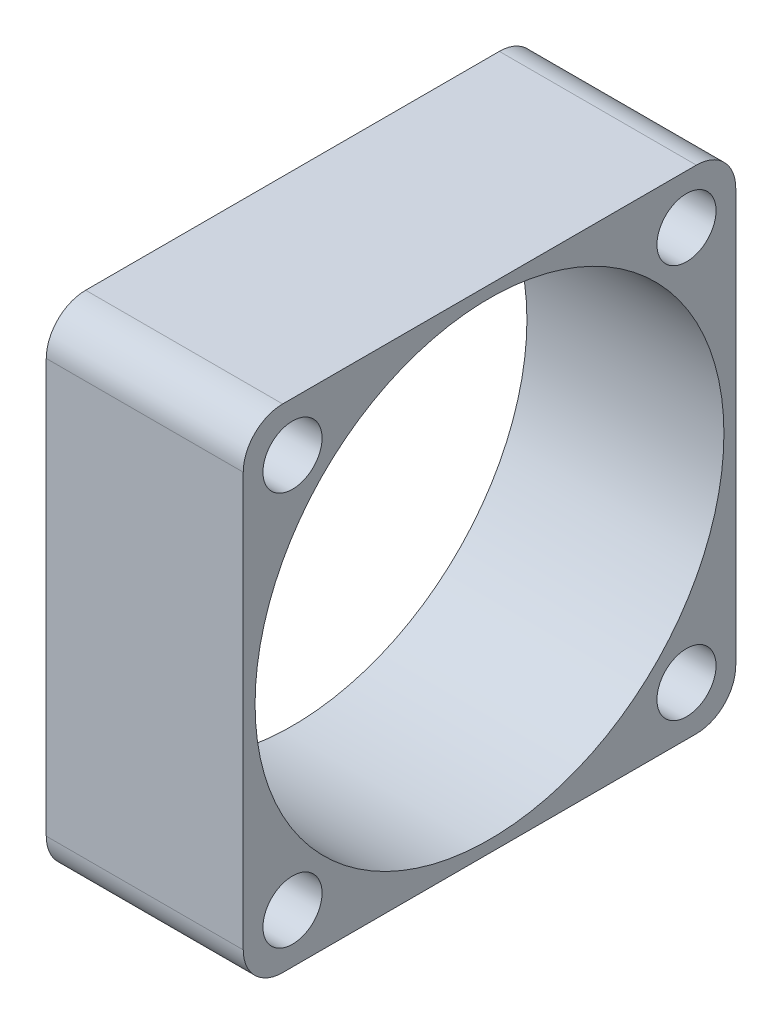
ISO-10303-21;
HEADER;
FILE_DESCRIPTION(('STEP AP214'),'2;1');
FILE_NAME('part.step','',(''),(''),'','','');
FILE_SCHEMA(('AUTOMOTIVE_DESIGN { 1 0 10303 214 1 1 1 1 }'));
ENDSEC;
DATA;
#1=APPLICATION_CONTEXT('core data for automotive mechanical design processes');
#2=APPLICATION_PROTOCOL_DEFINITION('international standard','automotive_design',2000,#1);
#3=PRODUCT_CONTEXT('',#1,'mechanical');
#4=PRODUCT('Part','Part','',(#3));
#5=PRODUCT_RELATED_PRODUCT_CATEGORY('part','',(#4));
#6=PRODUCT_DEFINITION_FORMATION('','',#4);
#7=PRODUCT_DEFINITION_CONTEXT('part definition',#1,'design');
#8=PRODUCT_DEFINITION('design','',#6,#7);
#9=PRODUCT_DEFINITION_SHAPE('','',#8);
#10=(LENGTH_UNIT() NAMED_UNIT(*) SI_UNIT(.MILLI.,.METRE.));
#11=(NAMED_UNIT(*) PLANE_ANGLE_UNIT() SI_UNIT($,.RADIAN.));
#12=(NAMED_UNIT(*) SI_UNIT($,.STERADIAN.) SOLID_ANGLE_UNIT());
#13=UNCERTAINTY_MEASURE_WITH_UNIT(LENGTH_MEASURE(1.E-05),#10,'distance_accuracy_value','');
#14=(GEOMETRIC_REPRESENTATION_CONTEXT(3) GLOBAL_UNCERTAINTY_ASSIGNED_CONTEXT((#13)) GLOBAL_UNIT_ASSIGNED_CONTEXT((#10,
#11,#12)) REPRESENTATION_CONTEXT('',''));
#15=CARTESIAN_POINT('',(0.,0.,0.));
#16=DIRECTION('',(0.,0.,1.));
#17=DIRECTION('',(1.,0.,0.));
#18=AXIS2_PLACEMENT_3D('',#15,#16,#17);
#19=CARTESIAN_POINT('',(10.,-10.5,10.5));
#20=DIRECTION('',(-1.,0.,0.));
#21=DIRECTION('',(0.,0.,1.));
#22=AXIS2_PLACEMENT_3D('',#19,#20,#21);
#23=CYLINDRICAL_SURFACE('',#22,2.);
#24=CARTESIAN_POINT('',(0.,-10.5,10.5));
#25=DIRECTION('',(1.,0.,0.));
#26=DIRECTION('',(0.,0.,1.));
#27=AXIS2_PLACEMENT_3D('',#24,#25,#26);
#28=CIRCLE('',#27,2.);
#29=CARTESIAN_POINT('',(0.,-10.5,12.5));
#30=VERTEX_POINT('',#29);
#31=CARTESIAN_POINT('',(0.,-12.5,10.5));
#32=VERTEX_POINT('',#31);
#33=EDGE_CURVE('E113',#30,#32,#28,.T.);
#34=ORIENTED_EDGE('',*,*,#33,.T.);
#35=DIRECTION('',(-1.,0.,0.));
#36=VECTOR('',#35,1.);
#37=CARTESIAN_POINT('',(10.,-12.5,10.5));
#38=LINE('',#37,#36);
#39=CARTESIAN_POINT('',(10.,-12.5,10.5));
#40=VERTEX_POINT('',#39);
#41=EDGE_CURVE('E11',#40,#32,#38,.T.);
#42=ORIENTED_EDGE('',*,*,#41,.F.);
#43=CARTESIAN_POINT('',(10.,-10.5,10.5));
#44=DIRECTION('',(1.,0.,0.));
#45=DIRECTION('',(0.,0.,1.));
#46=AXIS2_PLACEMENT_3D('',#43,#44,#45);
#47=CIRCLE('',#46,2.);
#48=CARTESIAN_POINT('',(10.,-10.5,12.5));
#49=VERTEX_POINT('',#48);
#50=EDGE_CURVE('E128',#49,#40,#47,.T.);
#51=ORIENTED_EDGE('',*,*,#50,.F.);
#52=DIRECTION('',(-1.,0.,0.));
#53=VECTOR('',#52,1.);
#54=CARTESIAN_POINT('',(10.,-10.5,12.5));
#55=LINE('',#54,#53);
#56=EDGE_CURVE('E109',#49,#30,#55,.T.);
#57=ORIENTED_EDGE('',*,*,#56,.T.);
#58=EDGE_LOOP('',(#34,#42,#51,#57));
#59=FACE_BOUND('',#58,.T.);
#60=ADVANCED_FACE('F17',(#59),#23,.T.);
#61=CARTESIAN_POINT('',(10.,-12.5,-10.5));
#62=DIRECTION('',(0.,1.,0.));
#63=DIRECTION('',(0.,0.,1.));
#64=AXIS2_PLACEMENT_3D('',#61,#62,#63);
#65=PLANE('',#64);
#66=DIRECTION('',(0.,0.,-1.));
#67=VECTOR('',#66,1.);
#68=CARTESIAN_POINT('',(0.,-12.5,-10.5));
#69=LINE('',#68,#67);
#70=CARTESIAN_POINT('',(0.,-12.5,-10.5));
#71=VERTEX_POINT('',#70);
#72=EDGE_CURVE('E116',#32,#71,#69,.T.);
#73=ORIENTED_EDGE('',*,*,#72,.T.);
#74=DIRECTION('',(-1.,0.,0.));
#75=VECTOR('',#74,1.);
#76=CARTESIAN_POINT('',(10.,-12.5,-10.5));
#77=LINE('',#76,#75);
#78=CARTESIAN_POINT('',(10.,-12.5,-10.5));
#79=VERTEX_POINT('',#78);
#80=EDGE_CURVE('E25',#79,#71,#77,.T.);
#81=ORIENTED_EDGE('',*,*,#80,.F.);
#82=DIRECTION('',(0.,0.,-1.));
#83=VECTOR('',#82,1.);
#84=CARTESIAN_POINT('',(10.,-12.5,-10.5));
#85=LINE('',#84,#83);
#86=EDGE_CURVE('E76',#40,#79,#85,.T.);
#87=ORIENTED_EDGE('',*,*,#86,.F.);
#88=ORIENTED_EDGE('',*,*,#41,.T.);
#89=EDGE_LOOP('',(#73,#81,#87,#88));
#90=FACE_BOUND('',#89,.T.);
#91=ADVANCED_FACE('F224',(#90),#65,.F.);
#92=CARTESIAN_POINT('',(10.,-10.5,-10.5));
#93=DIRECTION('',(-1.,0.,0.));
#94=DIRECTION('',(0.,0.,1.));
#95=AXIS2_PLACEMENT_3D('',#92,#93,#94);
#96=CYLINDRICAL_SURFACE('',#95,2.);
#97=CARTESIAN_POINT('',(0.,-10.5,-10.5));
#98=DIRECTION('',(1.,0.,0.));
#99=DIRECTION('',(0.,0.,-1.));
#100=AXIS2_PLACEMENT_3D('',#97,#98,#99);
#101=CIRCLE('',#100,2.);
#102=CARTESIAN_POINT('',(0.,-10.5,-12.5));
#103=VERTEX_POINT('',#102);
#104=EDGE_CURVE('E119',#71,#103,#101,.T.);
#105=ORIENTED_EDGE('',*,*,#104,.T.);
#106=DIRECTION('',(-1.,0.,0.));
#107=VECTOR('',#106,1.);
#108=CARTESIAN_POINT('',(10.,-10.5,-12.5));
#109=LINE('',#108,#107);
#110=CARTESIAN_POINT('',(10.,-10.5,-12.5));
#111=VERTEX_POINT('',#110);
#112=EDGE_CURVE('E135',#111,#103,#109,.T.);
#113=ORIENTED_EDGE('',*,*,#112,.F.);
#114=CARTESIAN_POINT('',(10.,-10.5,-10.5));
#115=DIRECTION('',(1.,0.,0.));
#116=DIRECTION('',(0.,0.,-1.));
#117=AXIS2_PLACEMENT_3D('',#114,#115,#116);
#118=CIRCLE('',#117,2.);
#119=EDGE_CURVE('E143',#79,#111,#118,.T.);
#120=ORIENTED_EDGE('',*,*,#119,.F.);
#121=ORIENTED_EDGE('',*,*,#80,.T.);
#122=EDGE_LOOP('',(#105,#113,#120,#121));
#123=FACE_BOUND('',#122,.T.);
#124=ADVANCED_FACE('F141',(#123),#96,.T.);
#125=CARTESIAN_POINT('',(10.,-10.5,-12.5));
#126=DIRECTION('',(0.,0.,1.));
#127=DIRECTION('',(0.,-1.,0.));
#128=AXIS2_PLACEMENT_3D('',#125,#126,#127);
#129=PLANE('',#128);
#130=DIRECTION('',(0.,1.,0.));
#131=VECTOR('',#130,1.);
#132=CARTESIAN_POINT('',(0.,-10.5,-12.5));
#133=LINE('',#132,#131);
#134=CARTESIAN_POINT('',(0.,10.5,-12.5));
#135=VERTEX_POINT('',#134);
#136=EDGE_CURVE('E121',#103,#135,#133,.T.);
#137=ORIENTED_EDGE('',*,*,#136,.T.);
#138=DIRECTION('',(-1.,0.,0.));
#139=VECTOR('',#138,1.);
#140=CARTESIAN_POINT('',(10.,10.5,-12.5));
#141=LINE('',#140,#139);
#142=CARTESIAN_POINT('',(10.,10.5,-12.5));
#143=VERTEX_POINT('',#142);
#144=EDGE_CURVE('E132',#143,#135,#141,.T.);
#145=ORIENTED_EDGE('',*,*,#144,.F.);
#146=DIRECTION('',(0.,1.,0.));
#147=VECTOR('',#146,1.);
#148=CARTESIAN_POINT('',(10.,-10.5,-12.5));
#149=LINE('',#148,#147);
#150=EDGE_CURVE('E155',#111,#143,#149,.T.);
#151=ORIENTED_EDGE('',*,*,#150,.F.);
#152=ORIENTED_EDGE('',*,*,#112,.T.);
#153=EDGE_LOOP('',(#137,#145,#151,#152));
#154=FACE_BOUND('',#153,.T.);
#155=ADVANCED_FACE('F151',(#154),#129,.F.);
#156=CARTESIAN_POINT('',(10.,10.5,-10.5));
#157=DIRECTION('',(-1.,0.,0.));
#158=DIRECTION('',(0.,0.,1.));
#159=AXIS2_PLACEMENT_3D('',#156,#157,#158);
#160=CYLINDRICAL_SURFACE('',#159,2.);
#161=CARTESIAN_POINT('',(0.,10.5,-10.5));
#162=DIRECTION('',(1.,0.,0.));
#163=DIRECTION('',(0.,0.,-1.));
#164=AXIS2_PLACEMENT_3D('',#161,#162,#163);
#165=CIRCLE('',#164,2.);
#166=CARTESIAN_POINT('',(0.,12.5,-10.5));
#167=VERTEX_POINT('',#166);
#168=EDGE_CURVE('E123',#135,#167,#165,.T.);
#169=ORIENTED_EDGE('',*,*,#168,.T.);
#170=DIRECTION('',(-1.,0.,0.));
#171=VECTOR('',#170,1.);
#172=CARTESIAN_POINT('',(10.,12.5,-10.5));
#173=LINE('',#172,#171);
#174=CARTESIAN_POINT('',(10.,12.5,-10.5));
#175=VERTEX_POINT('',#174);
#176=EDGE_CURVE('E104',#175,#167,#173,.T.);
#177=ORIENTED_EDGE('',*,*,#176,.F.);
#178=CARTESIAN_POINT('',(10.,10.5,-10.5));
#179=DIRECTION('',(1.,0.,0.));
#180=DIRECTION('',(0.,0.,-1.));
#181=AXIS2_PLACEMENT_3D('',#178,#179,#180);
#182=CIRCLE('',#181,2.);
#183=EDGE_CURVE('E95',#143,#175,#182,.T.);
#184=ORIENTED_EDGE('',*,*,#183,.F.);
#185=ORIENTED_EDGE('',*,*,#144,.T.);
#186=EDGE_LOOP('',(#169,#177,#184,#185));
#187=FACE_BOUND('',#186,.T.);
#188=ADVANCED_FACE('F154',(#187),#160,.T.);
#189=CARTESIAN_POINT('',(10.,12.5,-10.5));
#190=DIRECTION('',(0.,-1.,0.));
#191=DIRECTION('',(0.,0.,-1.));
#192=AXIS2_PLACEMENT_3D('',#189,#190,#191);
#193=PLANE('',#192);
#194=DIRECTION('',(0.,0.,1.));
#195=VECTOR('',#194,1.);
#196=CARTESIAN_POINT('',(0.,12.5,-10.5));
#197=LINE('',#196,#195);
#198=CARTESIAN_POINT('',(0.,12.5,10.5));
#199=VERTEX_POINT('',#198);
#200=EDGE_CURVE('E103',#167,#199,#197,.T.);
#201=ORIENTED_EDGE('',*,*,#200,.T.);
#202=DIRECTION('',(-1.,0.,0.));
#203=VECTOR('',#202,1.);
#204=CARTESIAN_POINT('',(10.,12.5,10.5));
#205=LINE('',#204,#203);
#206=CARTESIAN_POINT('',(10.,12.5,10.5));
#207=VERTEX_POINT('',#206);
#208=EDGE_CURVE('E100',#207,#199,#205,.T.);
#209=ORIENTED_EDGE('',*,*,#208,.F.);
#210=DIRECTION('',(0.,0.,1.));
#211=VECTOR('',#210,1.);
#212=CARTESIAN_POINT('',(10.,12.5,-10.5));
#213=LINE('',#212,#211);
#214=EDGE_CURVE('E89',#175,#207,#213,.T.);
#215=ORIENTED_EDGE('',*,*,#214,.F.);
#216=ORIENTED_EDGE('',*,*,#176,.T.);
#217=EDGE_LOOP('',(#201,#209,#215,#216));
#218=FACE_BOUND('',#217,.T.);
#219=ADVANCED_FACE('F101',(#218),#193,.F.);
#220=CARTESIAN_POINT('',(10.,10.5,10.5));
#221=DIRECTION('',(-1.,0.,0.));
#222=DIRECTION('',(0.,0.,1.));
#223=AXIS2_PLACEMENT_3D('',#220,#221,#222);
#224=CYLINDRICAL_SURFACE('',#223,2.);
#225=CARTESIAN_POINT('',(0.,10.5,10.5));
#226=DIRECTION('',(1.,0.,0.));
#227=DIRECTION('',(0.,0.,-1.));
#228=AXIS2_PLACEMENT_3D('',#225,#226,#227);
#229=CIRCLE('',#228,2.);
#230=CARTESIAN_POINT('',(0.,10.5,12.5));
#231=VERTEX_POINT('',#230);
#232=EDGE_CURVE('E62',#199,#231,#229,.T.);
#233=ORIENTED_EDGE('',*,*,#232,.T.);
#234=DIRECTION('',(-1.,0.,0.));
#235=VECTOR('',#234,1.);
#236=CARTESIAN_POINT('',(10.,10.5,12.5));
#237=LINE('',#236,#235);
#238=CARTESIAN_POINT('',(10.,10.5,12.5));
#239=VERTEX_POINT('',#238);
#240=EDGE_CURVE('E105',#239,#231,#237,.T.);
#241=ORIENTED_EDGE('',*,*,#240,.F.);
#242=CARTESIAN_POINT('',(10.,10.5,10.5));
#243=DIRECTION('',(1.,0.,0.));
#244=DIRECTION('',(0.,0.,-1.));
#245=AXIS2_PLACEMENT_3D('',#242,#243,#244);
#246=CIRCLE('',#245,2.);
#247=EDGE_CURVE('E93',#207,#239,#246,.T.);
#248=ORIENTED_EDGE('',*,*,#247,.F.);
#249=ORIENTED_EDGE('',*,*,#208,.T.);
#250=EDGE_LOOP('',(#233,#241,#248,#249));
#251=FACE_BOUND('',#250,.T.);
#252=ADVANCED_FACE('F107',(#251),#224,.T.);
#253=CARTESIAN_POINT('',(10.,-10.5,12.5));
#254=DIRECTION('',(0.,0.,-1.));
#255=DIRECTION('',(0.,1.,0.));
#256=AXIS2_PLACEMENT_3D('',#253,#254,#255);
#257=PLANE('',#256);
#258=DIRECTION('',(0.,-1.,0.));
#259=VECTOR('',#258,1.);
#260=CARTESIAN_POINT('',(0.,-10.5,12.5));
#261=LINE('',#260,#259);
#262=EDGE_CURVE('E68',#231,#30,#261,.T.);
#263=ORIENTED_EDGE('',*,*,#262,.T.);
#264=ORIENTED_EDGE('',*,*,#56,.F.);
#265=DIRECTION('',(0.,-1.,0.));
#266=VECTOR('',#265,1.);
#267=CARTESIAN_POINT('',(10.,-10.5,12.5));
#268=LINE('',#267,#266);
#269=EDGE_CURVE('E33',#239,#49,#268,.T.);
#270=ORIENTED_EDGE('',*,*,#269,.F.);
#271=ORIENTED_EDGE('',*,*,#240,.T.);
#272=EDGE_LOOP('',(#263,#264,#270,#271));
#273=FACE_BOUND('',#272,.T.);
#274=ADVANCED_FACE('F196',(#273),#257,.F.);
#275=CARTESIAN_POINT('',(10.,-10.5,10.5));
#276=DIRECTION('',(-1.,0.,0.));
#277=DIRECTION('',(0.,0.,1.));
#278=AXIS2_PLACEMENT_3D('',#275,#276,#277);
#279=PLANE('',#278);
#280=CARTESIAN_POINT('',(10.,0.,0.));
#281=DIRECTION('',(1.,0.,0.));
#282=DIRECTION('',(0.,0.,-1.));
#283=AXIS2_PLACEMENT_3D('',#280,#281,#282);
#284=CIRCLE('',#283,11.9);
#285=CARTESIAN_POINT('',(10.,0.,-11.9));
#286=VERTEX_POINT('',#285);
#287=EDGE_CURVE('E184',#286,#286,#284,.T.);
#288=ORIENTED_EDGE('',*,*,#287,.F.);
#289=EDGE_LOOP('',(#288));
#290=FACE_BOUND('',#289,.T.);
#291=CARTESIAN_POINT('',(10.,10.,10.));
#292=DIRECTION('',(1.,0.,0.));
#293=DIRECTION('',(0.,0.,-1.));
#294=AXIS2_PLACEMENT_3D('',#291,#292,#293);
#295=CIRCLE('',#294,1.5);
#296=CARTESIAN_POINT('',(10.,10.,8.5));
#297=VERTEX_POINT('',#296);
#298=EDGE_CURVE('E181',#297,#297,#295,.T.);
#299=ORIENTED_EDGE('',*,*,#298,.F.);
#300=EDGE_LOOP('',(#299));
#301=FACE_BOUND('',#300,.T.);
#302=CARTESIAN_POINT('',(10.,10.,-10.));
#303=DIRECTION('',(1.,0.,0.));
#304=DIRECTION('',(0.,0.,-1.));
#305=AXIS2_PLACEMENT_3D('',#302,#303,#304);
#306=CIRCLE('',#305,1.5);
#307=CARTESIAN_POINT('',(10.,10.,-11.5));
#308=VERTEX_POINT('',#307);
#309=EDGE_CURVE('E175',#308,#308,#306,.T.);
#310=ORIENTED_EDGE('',*,*,#309,.F.);
#311=EDGE_LOOP('',(#310));
#312=FACE_BOUND('',#311,.T.);
#313=CARTESIAN_POINT('',(10.,-10.,-10.));
#314=DIRECTION('',(1.,0.,0.));
#315=DIRECTION('',(0.,0.,-1.));
#316=AXIS2_PLACEMENT_3D('',#313,#314,#315);
#317=CIRCLE('',#316,1.5);
#318=CARTESIAN_POINT('',(10.,-10.,-11.5));
#319=VERTEX_POINT('',#318);
#320=EDGE_CURVE('E169',#319,#319,#317,.T.);
#321=ORIENTED_EDGE('',*,*,#320,.F.);
#322=EDGE_LOOP('',(#321));
#323=FACE_BOUND('',#322,.T.);
#324=CARTESIAN_POINT('',(10.,-10.,10.));
#325=DIRECTION('',(1.,0.,0.));
#326=DIRECTION('',(0.,0.,-1.));
#327=AXIS2_PLACEMENT_3D('',#324,#325,#326);
#328=CIRCLE('',#327,1.5);
#329=CARTESIAN_POINT('',(10.,-10.,8.5));
#330=VERTEX_POINT('',#329);
#331=EDGE_CURVE('E163',#330,#330,#328,.T.);
#332=ORIENTED_EDGE('',*,*,#331,.F.);
#333=EDGE_LOOP('',(#332));
#334=FACE_BOUND('',#333,.T.);
#335=ORIENTED_EDGE('',*,*,#50,.T.);
#336=ORIENTED_EDGE('',*,*,#86,.T.);
#337=ORIENTED_EDGE('',*,*,#119,.T.);
#338=ORIENTED_EDGE('',*,*,#150,.T.);
#339=ORIENTED_EDGE('',*,*,#183,.T.);
#340=ORIENTED_EDGE('',*,*,#214,.T.);
#341=ORIENTED_EDGE('',*,*,#247,.T.);
#342=ORIENTED_EDGE('',*,*,#269,.T.);
#343=EDGE_LOOP('',(#335,#336,#337,#338,#339,#340,#341,#342));
#344=FACE_BOUND('',#343,.T.);
#345=ADVANCED_FACE('F91',(#290,#301,#312,#323,#334,#344),#279,.F.);
#346=CARTESIAN_POINT('',(0.,-10.5,10.5));
#347=DIRECTION('',(-1.,0.,0.));
#348=DIRECTION('',(0.,0.,1.));
#349=AXIS2_PLACEMENT_3D('',#346,#347,#348);
#350=PLANE('',#349);
#351=CARTESIAN_POINT('',(0.,0.,0.));
#352=DIRECTION('',(1.,0.,0.));
#353=DIRECTION('',(0.,0.,-1.));
#354=AXIS2_PLACEMENT_3D('',#351,#352,#353);
#355=CIRCLE('',#354,11.9);
#356=CARTESIAN_POINT('',(0.,0.,-11.9));
#357=VERTEX_POINT('',#356);
#358=EDGE_CURVE('E185',#357,#357,#355,.T.);
#359=ORIENTED_EDGE('',*,*,#358,.T.);
#360=EDGE_LOOP('',(#359));
#361=FACE_BOUND('',#360,.T.);
#362=CARTESIAN_POINT('',(0.,10.,10.));
#363=DIRECTION('',(1.,0.,0.));
#364=DIRECTION('',(0.,0.,-1.));
#365=AXIS2_PLACEMENT_3D('',#362,#363,#364);
#366=CIRCLE('',#365,1.5);
#367=CARTESIAN_POINT('',(0.,10.,8.5));
#368=VERTEX_POINT('',#367);
#369=EDGE_CURVE('E178',#368,#368,#366,.T.);
#370=ORIENTED_EDGE('',*,*,#369,.T.);
#371=EDGE_LOOP('',(#370));
#372=FACE_BOUND('',#371,.T.);
#373=CARTESIAN_POINT('',(0.,10.,-10.));
#374=DIRECTION('',(1.,0.,0.));
#375=DIRECTION('',(0.,0.,-1.));
#376=AXIS2_PLACEMENT_3D('',#373,#374,#375);
#377=CIRCLE('',#376,1.5);
#378=CARTESIAN_POINT('',(0.,10.,-11.5));
#379=VERTEX_POINT('',#378);
#380=EDGE_CURVE('E172',#379,#379,#377,.T.);
#381=ORIENTED_EDGE('',*,*,#380,.T.);
#382=EDGE_LOOP('',(#381));
#383=FACE_BOUND('',#382,.T.);
#384=CARTESIAN_POINT('',(0.,-10.,-10.));
#385=DIRECTION('',(1.,0.,0.));
#386=DIRECTION('',(0.,0.,-1.));
#387=AXIS2_PLACEMENT_3D('',#384,#385,#386);
#388=CIRCLE('',#387,1.5);
#389=CARTESIAN_POINT('',(0.,-10.,-11.5));
#390=VERTEX_POINT('',#389);
#391=EDGE_CURVE('E166',#390,#390,#388,.T.);
#392=ORIENTED_EDGE('',*,*,#391,.T.);
#393=EDGE_LOOP('',(#392));
#394=FACE_BOUND('',#393,.T.);
#395=CARTESIAN_POINT('',(0.,-10.,10.));
#396=DIRECTION('',(1.,0.,0.));
#397=DIRECTION('',(0.,0.,-1.));
#398=AXIS2_PLACEMENT_3D('',#395,#396,#397);
#399=CIRCLE('',#398,1.5);
#400=CARTESIAN_POINT('',(0.,-10.,8.5));
#401=VERTEX_POINT('',#400);
#402=EDGE_CURVE('E117',#401,#401,#399,.T.);
#403=ORIENTED_EDGE('',*,*,#402,.T.);
#404=EDGE_LOOP('',(#403));
#405=FACE_BOUND('',#404,.T.);
#406=ORIENTED_EDGE('',*,*,#33,.F.);
#407=ORIENTED_EDGE('',*,*,#262,.F.);
#408=ORIENTED_EDGE('',*,*,#232,.F.);
#409=ORIENTED_EDGE('',*,*,#200,.F.);
#410=ORIENTED_EDGE('',*,*,#168,.F.);
#411=ORIENTED_EDGE('',*,*,#136,.F.);
#412=ORIENTED_EDGE('',*,*,#104,.F.);
#413=ORIENTED_EDGE('',*,*,#72,.F.);
#414=EDGE_LOOP('',(#406,#407,#408,#409,#410,#411,#412,#413));
#415=FACE_BOUND('',#414,.T.);
#416=ADVANCED_FACE('F147',(#361,#372,#383,#394,#405,#415),#350,.T.);
#417=CARTESIAN_POINT('',(10.,-10.,10.));
#418=DIRECTION('',(1.,0.,0.));
#419=DIRECTION('',(0.,0.,-1.));
#420=AXIS2_PLACEMENT_3D('',#417,#418,#419);
#421=CYLINDRICAL_SURFACE('',#420,1.5);
#422=ORIENTED_EDGE('',*,*,#402,.F.);
#423=EDGE_LOOP('',(#422));
#424=FACE_BOUND('',#423,.T.);
#425=ORIENTED_EDGE('',*,*,#331,.T.);
#426=EDGE_LOOP('',(#425));
#427=FACE_BOUND('',#426,.T.);
#428=ADVANCED_FACE('F206',(#424,#427),#421,.F.);
#429=CARTESIAN_POINT('',(10.,-10.,-10.));
#430=DIRECTION('',(1.,0.,0.));
#431=DIRECTION('',(0.,0.,-1.));
#432=AXIS2_PLACEMENT_3D('',#429,#430,#431);
#433=CYLINDRICAL_SURFACE('',#432,1.5);
#434=ORIENTED_EDGE('',*,*,#391,.F.);
#435=EDGE_LOOP('',(#434));
#436=FACE_BOUND('',#435,.T.);
#437=ORIENTED_EDGE('',*,*,#320,.T.);
#438=EDGE_LOOP('',(#437));
#439=FACE_BOUND('',#438,.T.);
#440=ADVANCED_FACE('F208',(#436,#439),#433,.F.);
#441=CARTESIAN_POINT('',(10.,10.,-10.));
#442=DIRECTION('',(1.,0.,0.));
#443=DIRECTION('',(0.,0.,-1.));
#444=AXIS2_PLACEMENT_3D('',#441,#442,#443);
#445=CYLINDRICAL_SURFACE('',#444,1.5);
#446=ORIENTED_EDGE('',*,*,#380,.F.);
#447=EDGE_LOOP('',(#446));
#448=FACE_BOUND('',#447,.T.);
#449=ORIENTED_EDGE('',*,*,#309,.T.);
#450=EDGE_LOOP('',(#449));
#451=FACE_BOUND('',#450,.T.);
#452=ADVANCED_FACE('F217',(#448,#451),#445,.F.);
#453=CARTESIAN_POINT('',(10.,10.,10.));
#454=DIRECTION('',(1.,0.,0.));
#455=DIRECTION('',(0.,0.,-1.));
#456=AXIS2_PLACEMENT_3D('',#453,#454,#455);
#457=CYLINDRICAL_SURFACE('',#456,1.5);
#458=ORIENTED_EDGE('',*,*,#369,.F.);
#459=EDGE_LOOP('',(#458));
#460=FACE_BOUND('',#459,.T.);
#461=ORIENTED_EDGE('',*,*,#298,.T.);
#462=EDGE_LOOP('',(#461));
#463=FACE_BOUND('',#462,.T.);
#464=ADVANCED_FACE('F312',(#460,#463),#457,.F.);
#465=CARTESIAN_POINT('',(10.,0.,0.));
#466=DIRECTION('',(-1.,0.,0.));
#467=DIRECTION('',(0.,0.,1.));
#468=AXIS2_PLACEMENT_3D('',#465,#466,#467);
#469=CYLINDRICAL_SURFACE('',#468,11.9);
#470=ORIENTED_EDGE('',*,*,#287,.T.);
#471=EDGE_LOOP('',(#470));
#472=FACE_BOUND('',#471,.T.);
#473=ORIENTED_EDGE('',*,*,#358,.F.);
#474=EDGE_LOOP('',(#473));
#475=FACE_BOUND('',#474,.T.);
#476=ADVANCED_FACE('F191',(#472,#475),#469,.F.);
#477=CLOSED_SHELL('',(#60,#91,#124,#155,#188,#219,#252,#274,#345,#416,#428,#440,#452,#464,#476));
#478=MANIFOLD_SOLID_BREP('B1',#477);
#479=ADVANCED_BREP_SHAPE_REPRESENTATION('',(#18,#478),#14);
#480=SHAPE_DEFINITION_REPRESENTATION(#9,#479);
ENDSEC;
END-ISO-10303-21;
